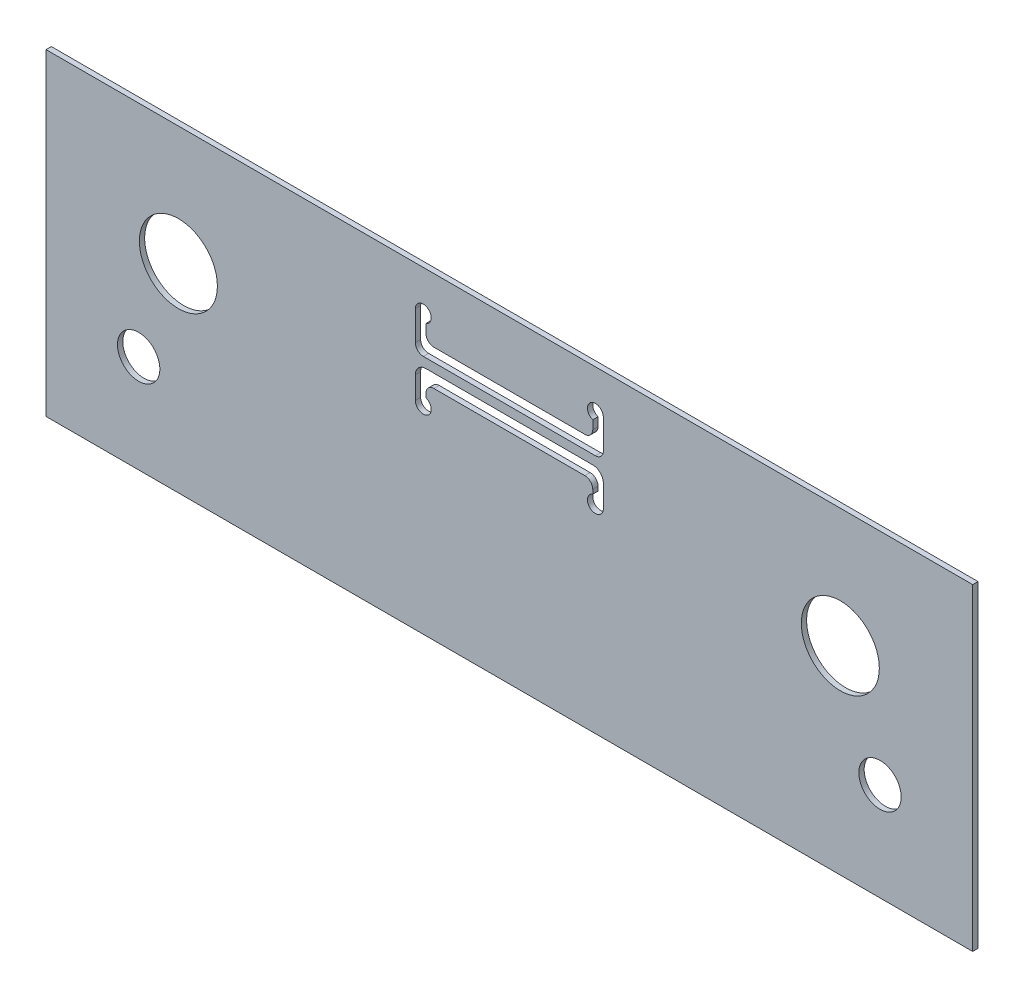
ISO-10303-21;
HEADER;
FILE_DESCRIPTION(('STEP AP214'),'2;1');
FILE_NAME('part.step','',(''),(''),'','','');
FILE_SCHEMA(('AUTOMOTIVE_DESIGN { 1 0 10303 214 1 1 1 1 }'));
ENDSEC;
DATA;
#1=APPLICATION_CONTEXT('core data for automotive mechanical design processes');
#2=APPLICATION_PROTOCOL_DEFINITION('international standard','automotive_design',2000,#1);
#3=PRODUCT_CONTEXT('',#1,'mechanical');
#4=PRODUCT('Part','Part','',(#3));
#5=PRODUCT_RELATED_PRODUCT_CATEGORY('part','',(#4));
#6=PRODUCT_DEFINITION_FORMATION('','',#4);
#7=PRODUCT_DEFINITION_CONTEXT('part definition',#1,'design');
#8=PRODUCT_DEFINITION('design','',#6,#7);
#9=PRODUCT_DEFINITION_SHAPE('','',#8);
#10=(LENGTH_UNIT() NAMED_UNIT(*) SI_UNIT(.MILLI.,.METRE.));
#11=(NAMED_UNIT(*) PLANE_ANGLE_UNIT() SI_UNIT($,.RADIAN.));
#12=(NAMED_UNIT(*) SI_UNIT($,.STERADIAN.) SOLID_ANGLE_UNIT());
#13=UNCERTAINTY_MEASURE_WITH_UNIT(LENGTH_MEASURE(1.E-05),#10,'distance_accuracy_value','');
#14=(GEOMETRIC_REPRESENTATION_CONTEXT(3) GLOBAL_UNCERTAINTY_ASSIGNED_CONTEXT((#13)) GLOBAL_UNIT_ASSIGNED_CONTEXT((#10,
#11,#12)) REPRESENTATION_CONTEXT('',''));
#15=CARTESIAN_POINT('',(0.,0.,0.));
#16=DIRECTION('',(0.,0.,1.));
#17=DIRECTION('',(1.,0.,0.));
#18=AXIS2_PLACEMENT_3D('',#15,#16,#17);
#19=CARTESIAN_POINT('',(0.,0.,0.2));
#20=DIRECTION('',(0.,0.,-1.));
#21=DIRECTION('',(-1.,0.,0.));
#22=AXIS2_PLACEMENT_3D('',#19,#20,#21);
#23=PLANE('',#22);
#24=CARTESIAN_POINT('',(30.,-4.5,0.2));
#25=DIRECTION('',(0.,0.,1.));
#26=DIRECTION('',(1.,0.,0.));
#27=AXIS2_PLACEMENT_3D('',#24,#25,#26);
#28=CIRCLE('',#27,1.4732);
#29=CARTESIAN_POINT('',(31.4732,-4.5,0.2));
#30=VERTEX_POINT('',#29);
#31=EDGE_CURVE('E263',#30,#30,#28,.T.);
#32=ORIENTED_EDGE('',*,*,#31,.F.);
#33=EDGE_LOOP('',(#32));
#34=FACE_BOUND('',#33,.T.);
#35=CARTESIAN_POINT('',(5.,-4.5,0.2));
#36=DIRECTION('',(0.,0.,1.));
#37=DIRECTION('',(1.,0.,0.));
#38=AXIS2_PLACEMENT_3D('',#35,#36,#37);
#39=CIRCLE('',#38,1.4732);
#40=CARTESIAN_POINT('',(6.4732,-4.5,0.2));
#41=VERTEX_POINT('',#40);
#42=EDGE_CURVE('E313',#41,#41,#39,.T.);
#43=ORIENTED_EDGE('',*,*,#42,.F.);
#44=EDGE_LOOP('',(#43));
#45=FACE_BOUND('',#44,.T.);
#46=CARTESIAN_POINT('',(3.5,-8.3,0.2));
#47=DIRECTION('',(0.,0.,1.));
#48=DIRECTION('',(1.,0.,0.));
#49=AXIS2_PLACEMENT_3D('',#46,#47,#48);
#50=CIRCLE('',#49,0.800099999999999);
#51=CARTESIAN_POINT('',(4.3001,-8.3,0.2));
#52=VERTEX_POINT('',#51);
#53=EDGE_CURVE('E406',#52,#52,#50,.T.);
#54=ORIENTED_EDGE('',*,*,#53,.F.);
#55=EDGE_LOOP('',(#54));
#56=FACE_BOUND('',#55,.T.);
#57=DIRECTION('',(0.,-1.,0.));
#58=VECTOR('',#57,1.);
#59=CARTESIAN_POINT('',(0.,-12.,0.2));
#60=LINE('',#59,#58);
#61=CARTESIAN_POINT('',(0.,0.,0.2));
#62=VERTEX_POINT('',#61);
#63=CARTESIAN_POINT('',(0.,-12.,0.2));
#64=VERTEX_POINT('',#63);
#65=EDGE_CURVE('E412',#62,#64,#60,.T.);
#66=ORIENTED_EDGE('',*,*,#65,.T.);
#67=DIRECTION('',(1.,0.,0.));
#68=VECTOR('',#67,1.);
#69=CARTESIAN_POINT('',(35.,-12.,0.2));
#70=LINE('',#69,#68);
#71=CARTESIAN_POINT('',(35.,-12.,0.2));
#72=VERTEX_POINT('',#71);
#73=EDGE_CURVE('E415',#64,#72,#70,.T.);
#74=ORIENTED_EDGE('',*,*,#73,.T.);
#75=DIRECTION('',(0.,1.,0.));
#76=VECTOR('',#75,1.);
#77=CARTESIAN_POINT('',(35.,0.,0.2));
#78=LINE('',#77,#76);
#79=CARTESIAN_POINT('',(35.,0.,0.2));
#80=VERTEX_POINT('',#79);
#81=EDGE_CURVE('E418',#72,#80,#78,.T.);
#82=ORIENTED_EDGE('',*,*,#81,.T.);
#83=DIRECTION('',(-1.,0.,0.));
#84=VECTOR('',#83,1.);
#85=CARTESIAN_POINT('',(0.,0.,0.2));
#86=LINE('',#85,#84);
#87=EDGE_CURVE('E420',#80,#62,#86,.T.);
#88=ORIENTED_EDGE('',*,*,#87,.T.);
#89=EDGE_LOOP('',(#66,#74,#82,#88));
#90=FACE_BOUND('',#89,.T.);
#91=CARTESIAN_POINT('',(14.35,-3.66,0.2));
#92=DIRECTION('',(0.,0.,1.));
#93=DIRECTION('',(-1.,0.,0.));
#94=AXIS2_PLACEMENT_3D('',#91,#92,#93);
#95=CIRCLE('',#94,0.400000000000001);
#96=CARTESIAN_POINT('',(14.35,-3.26,0.2));
#97=VERTEX_POINT('',#96);
#98=CARTESIAN_POINT('',(13.95,-3.66,0.2));
#99=VERTEX_POINT('',#98);
#100=EDGE_CURVE('E319',#97,#99,#95,.T.);
#101=ORIENTED_EDGE('',*,*,#100,.F.);
#102=DIRECTION('',(-1.,0.,0.));
#103=VECTOR('',#102,1.);
#104=CARTESIAN_POINT('',(14.35,-3.26,0.2));
#105=LINE('',#104,#103);
#106=CARTESIAN_POINT('',(20.65,-3.26,0.2));
#107=VERTEX_POINT('',#106);
#108=EDGE_CURVE('E343',#107,#97,#105,.T.);
#109=ORIENTED_EDGE('',*,*,#108,.F.);
#110=CARTESIAN_POINT('',(20.65,-3.66,0.2));
#111=DIRECTION('',(0.,0.,1.));
#112=DIRECTION('',(-1.,0.,0.));
#113=AXIS2_PLACEMENT_3D('',#110,#111,#112);
#114=CIRCLE('',#113,0.400000000000002);
#115=CARTESIAN_POINT('',(21.05,-3.66,0.2));
#116=VERTEX_POINT('',#115);
#117=EDGE_CURVE('E340',#116,#107,#114,.T.);
#118=ORIENTED_EDGE('',*,*,#117,.F.);
#119=DIRECTION('',(0.,1.,0.));
#120=VECTOR('',#119,1.);
#121=CARTESIAN_POINT('',(21.05,-3.66,0.2));
#122=LINE('',#121,#120);
#123=CARTESIAN_POINT('',(21.05,-4.5,0.2));
#124=VERTEX_POINT('',#123);
#125=EDGE_CURVE('E338',#124,#116,#122,.T.);
#126=ORIENTED_EDGE('',*,*,#125,.F.);
#127=CARTESIAN_POINT('',(20.75,-4.5,0.2));
#128=DIRECTION('',(0.,0.,1.));
#129=DIRECTION('',(1.,0.,0.));
#130=AXIS2_PLACEMENT_3D('',#127,#128,#129);
#131=CIRCLE('',#130,0.300000000000001);
#132=CARTESIAN_POINT('',(20.65,-4.21715728752538,0.2));
#133=VERTEX_POINT('',#132);
#134=EDGE_CURVE('E336',#133,#124,#131,.T.);
#135=ORIENTED_EDGE('',*,*,#134,.F.);
#136=DIRECTION('',(0.,-1.,0.));
#137=VECTOR('',#136,1.);
#138=CARTESIAN_POINT('',(20.65,-4.06,0.2));
#139=LINE('',#138,#137);
#140=CARTESIAN_POINT('',(20.65,-4.06,0.2));
#141=VERTEX_POINT('',#140);
#142=EDGE_CURVE('E334',#141,#133,#139,.T.);
#143=ORIENTED_EDGE('',*,*,#142,.F.);
#144=CARTESIAN_POINT('',(20.35,-4.06,0.2));
#145=DIRECTION('',(0.,0.,-1.));
#146=DIRECTION('',(-1.,0.,0.));
#147=AXIS2_PLACEMENT_3D('',#144,#145,#146);
#148=CIRCLE('',#147,0.299999999999999);
#149=CARTESIAN_POINT('',(20.35,-3.76,0.2));
#150=VERTEX_POINT('',#149);
#151=EDGE_CURVE('E332',#150,#141,#148,.T.);
#152=ORIENTED_EDGE('',*,*,#151,.F.);
#153=DIRECTION('',(1.,0.,0.));
#154=VECTOR('',#153,1.);
#155=CARTESIAN_POINT('',(14.65,-3.76,0.2));
#156=LINE('',#155,#154);
#157=CARTESIAN_POINT('',(14.65,-3.76,0.2));
#158=VERTEX_POINT('',#157);
#159=EDGE_CURVE('E330',#158,#150,#156,.T.);
#160=ORIENTED_EDGE('',*,*,#159,.F.);
#161=CARTESIAN_POINT('',(14.65,-4.06,0.2));
#162=DIRECTION('',(0.,0.,-1.));
#163=DIRECTION('',(-1.,0.,0.));
#164=AXIS2_PLACEMENT_3D('',#161,#162,#163);
#165=CIRCLE('',#164,0.299999999999999);
#166=CARTESIAN_POINT('',(14.35,-4.06,0.2));
#167=VERTEX_POINT('',#166);
#168=EDGE_CURVE('E328',#167,#158,#165,.T.);
#169=ORIENTED_EDGE('',*,*,#168,.F.);
#170=DIRECTION('',(0.,1.,0.));
#171=VECTOR('',#170,1.);
#172=CARTESIAN_POINT('',(14.35,-4.21715728752538,0.2));
#173=LINE('',#172,#171);
#174=CARTESIAN_POINT('',(14.35,-4.21715728752538,0.2));
#175=VERTEX_POINT('',#174);
#176=EDGE_CURVE('E326',#175,#167,#173,.T.);
#177=ORIENTED_EDGE('',*,*,#176,.F.);
#178=CARTESIAN_POINT('',(14.25,-4.5,0.2));
#179=DIRECTION('',(0.,0.,1.));
#180=DIRECTION('',(1.,0.,0.));
#181=AXIS2_PLACEMENT_3D('',#178,#179,#180);
#182=CIRCLE('',#181,0.3);
#183=CARTESIAN_POINT('',(13.95,-4.5,0.2));
#184=VERTEX_POINT('',#183);
#185=EDGE_CURVE('E324',#184,#175,#182,.T.);
#186=ORIENTED_EDGE('',*,*,#185,.F.);
#187=DIRECTION('',(0.,-1.,0.));
#188=VECTOR('',#187,1.);
#189=CARTESIAN_POINT('',(13.95,-4.5,0.2));
#190=LINE('',#189,#188);
#191=EDGE_CURVE('E321',#99,#184,#190,.T.);
#192=ORIENTED_EDGE('',*,*,#191,.F.);
#193=EDGE_LOOP('',(#101,#109,#118,#126,#135,#143,#152,#160,#169,#177,#186,#192));
#194=FACE_BOUND('',#193,.T.);
#195=CARTESIAN_POINT('',(14.65,-2.11,0.2));
#196=DIRECTION('',(0.,0.,-1.));
#197=DIRECTION('',(-1.,0.,0.));
#198=AXIS2_PLACEMENT_3D('',#195,#196,#197);
#199=CIRCLE('',#198,0.300000000000001);
#200=CARTESIAN_POINT('',(14.65,-2.41,0.2));
#201=VERTEX_POINT('',#200);
#202=CARTESIAN_POINT('',(14.35,-2.11,0.2));
#203=VERTEX_POINT('',#202);
#204=EDGE_CURVE('E217',#201,#203,#199,.T.);
#205=ORIENTED_EDGE('',*,*,#204,.F.);
#206=DIRECTION('',(-1.,0.,0.));
#207=VECTOR('',#206,1.);
#208=CARTESIAN_POINT('',(14.65,-2.41,0.2));
#209=LINE('',#208,#207);
#210=CARTESIAN_POINT('',(20.35,-2.41,0.2));
#211=VERTEX_POINT('',#210);
#212=EDGE_CURVE('E260',#211,#201,#209,.T.);
#213=ORIENTED_EDGE('',*,*,#212,.F.);
#214=CARTESIAN_POINT('',(20.35,-2.11,0.2));
#215=DIRECTION('',(0.,0.,-1.));
#216=DIRECTION('',(1.,0.,0.));
#217=AXIS2_PLACEMENT_3D('',#214,#215,#216);
#218=CIRCLE('',#217,0.300000000000001);
#219=CARTESIAN_POINT('',(20.65,-2.11,0.2));
#220=VERTEX_POINT('',#219);
#221=EDGE_CURVE('E258',#220,#211,#218,.T.);
#222=ORIENTED_EDGE('',*,*,#221,.F.);
#223=DIRECTION('',(0.,-1.,0.));
#224=VECTOR('',#223,1.);
#225=CARTESIAN_POINT('',(20.65,-2.11,0.2));
#226=LINE('',#225,#224);
#227=CARTESIAN_POINT('',(20.65,-1.78284271247462,0.2));
#228=VERTEX_POINT('',#227);
#229=EDGE_CURVE('E256',#228,#220,#226,.T.);
#230=ORIENTED_EDGE('',*,*,#229,.F.);
#231=CARTESIAN_POINT('',(20.75,-1.5,0.2));
#232=DIRECTION('',(0.,0.,1.));
#233=DIRECTION('',(1.,0.,0.));
#234=AXIS2_PLACEMENT_3D('',#231,#232,#233);
#235=CIRCLE('',#234,0.3);
#236=CARTESIAN_POINT('',(21.05,-1.5,0.2));
#237=VERTEX_POINT('',#236);
#238=EDGE_CURVE('E254',#237,#228,#235,.T.);
#239=ORIENTED_EDGE('',*,*,#238,.F.);
#240=DIRECTION('',(0.,1.,0.));
#241=VECTOR('',#240,1.);
#242=CARTESIAN_POINT('',(21.05,-2.61,0.2));
#243=LINE('',#242,#241);
#244=CARTESIAN_POINT('',(21.05,-2.61,0.2));
#245=VERTEX_POINT('',#244);
#246=EDGE_CURVE('E252',#245,#237,#243,.T.);
#247=ORIENTED_EDGE('',*,*,#246,.F.);
#248=CARTESIAN_POINT('',(20.75,-2.61,0.2));
#249=DIRECTION('',(0.,0.,1.));
#250=DIRECTION('',(1.,0.,0.));
#251=AXIS2_PLACEMENT_3D('',#248,#249,#250);
#252=CIRCLE('',#251,0.299999999999999);
#253=CARTESIAN_POINT('',(20.75,-2.91,0.2));
#254=VERTEX_POINT('',#253);
#255=EDGE_CURVE('E250',#254,#245,#252,.T.);
#256=ORIENTED_EDGE('',*,*,#255,.F.);
#257=DIRECTION('',(1.,0.,0.));
#258=VECTOR('',#257,1.);
#259=CARTESIAN_POINT('',(14.25,-2.91,0.2));
#260=LINE('',#259,#258);
#261=CARTESIAN_POINT('',(14.25,-2.91,0.2));
#262=VERTEX_POINT('',#261);
#263=EDGE_CURVE('E248',#262,#254,#260,.T.);
#264=ORIENTED_EDGE('',*,*,#263,.F.);
#265=CARTESIAN_POINT('',(14.25,-2.61,0.2));
#266=DIRECTION('',(0.,0.,1.));
#267=DIRECTION('',(1.,0.,0.));
#268=AXIS2_PLACEMENT_3D('',#265,#266,#267);
#269=CIRCLE('',#268,0.3);
#270=CARTESIAN_POINT('',(13.95,-2.61,0.2));
#271=VERTEX_POINT('',#270);
#272=EDGE_CURVE('E246',#271,#262,#269,.T.);
#273=ORIENTED_EDGE('',*,*,#272,.F.);
#274=DIRECTION('',(0.,-1.,0.));
#275=VECTOR('',#274,1.);
#276=CARTESIAN_POINT('',(13.95,-1.5,0.2));
#277=LINE('',#276,#275);
#278=CARTESIAN_POINT('',(13.95,-1.5,0.2));
#279=VERTEX_POINT('',#278);
#280=EDGE_CURVE('E241',#279,#271,#277,.T.);
#281=ORIENTED_EDGE('',*,*,#280,.F.);
#282=CARTESIAN_POINT('',(14.25,-1.5,0.2));
#283=DIRECTION('',(0.,0.,1.));
#284=DIRECTION('',(1.,0.,0.));
#285=AXIS2_PLACEMENT_3D('',#282,#283,#284);
#286=CIRCLE('',#285,0.3);
#287=CARTESIAN_POINT('',(14.35,-1.78284271247462,0.2));
#288=VERTEX_POINT('',#287);
#289=EDGE_CURVE('E239',#288,#279,#286,.T.);
#290=ORIENTED_EDGE('',*,*,#289,.F.);
#291=DIRECTION('',(0.,1.,0.));
#292=VECTOR('',#291,1.);
#293=CARTESIAN_POINT('',(14.35,-2.11,0.2));
#294=LINE('',#293,#292);
#295=EDGE_CURVE('E225',#203,#288,#294,.T.);
#296=ORIENTED_EDGE('',*,*,#295,.F.);
#297=EDGE_LOOP('',(#205,#213,#222,#230,#239,#247,#256,#264,#273,#281,#290,#296));
#298=FACE_BOUND('',#297,.T.);
#299=CARTESIAN_POINT('',(31.5,-8.3,0.2));
#300=DIRECTION('',(0.,0.,1.));
#301=DIRECTION('',(1.,0.,0.));
#302=AXIS2_PLACEMENT_3D('',#299,#300,#301);
#303=CIRCLE('',#302,0.800100000000007);
#304=CARTESIAN_POINT('',(32.3001,-8.3,0.2));
#305=VERTEX_POINT('',#304);
#306=EDGE_CURVE('E598',#305,#305,#303,.T.);
#307=ORIENTED_EDGE('',*,*,#306,.F.);
#308=EDGE_LOOP('',(#307));
#309=FACE_BOUND('',#308,.T.);
#310=ADVANCED_FACE('F32',(#34,#45,#56,#90,#194,#298,#309),#23,.F.);
#311=CARTESIAN_POINT('',(0.,0.,0.));
#312=DIRECTION('',(0.,0.,-1.));
#313=DIRECTION('',(-1.,0.,0.));
#314=AXIS2_PLACEMENT_3D('',#311,#312,#313);
#315=PLANE('',#314);
#316=CARTESIAN_POINT('',(30.,-4.5,0.));
#317=DIRECTION('',(0.,0.,1.));
#318=DIRECTION('',(1.,0.,0.));
#319=AXIS2_PLACEMENT_3D('',#316,#317,#318);
#320=CIRCLE('',#319,1.4732);
#321=CARTESIAN_POINT('',(31.4732,-4.5,0.));
#322=VERTEX_POINT('',#321);
#323=EDGE_CURVE('E604',#322,#322,#320,.T.);
#324=ORIENTED_EDGE('',*,*,#323,.T.);
#325=EDGE_LOOP('',(#324));
#326=FACE_BOUND('',#325,.T.);
#327=CARTESIAN_POINT('',(5.,-4.5,0.));
#328=DIRECTION('',(0.,0.,1.));
#329=DIRECTION('',(1.,0.,0.));
#330=AXIS2_PLACEMENT_3D('',#327,#328,#329);
#331=CIRCLE('',#330,1.4732);
#332=CARTESIAN_POINT('',(6.4732,-4.5,0.));
#333=VERTEX_POINT('',#332);
#334=EDGE_CURVE('E233',#333,#333,#331,.T.);
#335=ORIENTED_EDGE('',*,*,#334,.T.);
#336=EDGE_LOOP('',(#335));
#337=FACE_BOUND('',#336,.T.);
#338=CARTESIAN_POINT('',(3.5,-8.3,0.));
#339=DIRECTION('',(0.,0.,1.));
#340=DIRECTION('',(1.,0.,0.));
#341=AXIS2_PLACEMENT_3D('',#338,#339,#340);
#342=CIRCLE('',#341,0.800099999999999);
#343=CARTESIAN_POINT('',(4.3001,-8.3,0.));
#344=VERTEX_POINT('',#343);
#345=EDGE_CURVE('E405',#344,#344,#342,.T.);
#346=ORIENTED_EDGE('',*,*,#345,.T.);
#347=EDGE_LOOP('',(#346));
#348=FACE_BOUND('',#347,.T.);
#349=DIRECTION('',(0.,-1.,0.));
#350=VECTOR('',#349,1.);
#351=CARTESIAN_POINT('',(0.,-12.,0.));
#352=LINE('',#351,#350);
#353=CARTESIAN_POINT('',(0.,0.,0.));
#354=VERTEX_POINT('',#353);
#355=CARTESIAN_POINT('',(0.,-12.,0.));
#356=VERTEX_POINT('',#355);
#357=EDGE_CURVE('E409',#354,#356,#352,.T.);
#358=ORIENTED_EDGE('',*,*,#357,.F.);
#359=DIRECTION('',(-1.,0.,0.));
#360=VECTOR('',#359,1.);
#361=CARTESIAN_POINT('',(0.,0.,0.));
#362=LINE('',#361,#360);
#363=CARTESIAN_POINT('',(35.,0.,0.));
#364=VERTEX_POINT('',#363);
#365=EDGE_CURVE('E416',#364,#354,#362,.T.);
#366=ORIENTED_EDGE('',*,*,#365,.F.);
#367=DIRECTION('',(0.,1.,0.));
#368=VECTOR('',#367,1.);
#369=CARTESIAN_POINT('',(35.,0.,0.));
#370=LINE('',#369,#368);
#371=CARTESIAN_POINT('',(35.,-12.,0.));
#372=VERTEX_POINT('',#371);
#373=EDGE_CURVE('E427',#372,#364,#370,.T.);
#374=ORIENTED_EDGE('',*,*,#373,.F.);
#375=DIRECTION('',(1.,0.,0.));
#376=VECTOR('',#375,1.);
#377=CARTESIAN_POINT('',(35.,-12.,0.));
#378=LINE('',#377,#376);
#379=EDGE_CURVE('E425',#356,#372,#378,.T.);
#380=ORIENTED_EDGE('',*,*,#379,.F.);
#381=EDGE_LOOP('',(#358,#366,#374,#380));
#382=FACE_BOUND('',#381,.T.);
#383=DIRECTION('',(-1.,0.,0.));
#384=VECTOR('',#383,1.);
#385=CARTESIAN_POINT('',(14.35,-3.26,0.));
#386=LINE('',#385,#384);
#387=CARTESIAN_POINT('',(20.65,-3.26,0.));
#388=VERTEX_POINT('',#387);
#389=CARTESIAN_POINT('',(14.35,-3.26,0.));
#390=VERTEX_POINT('',#389);
#391=EDGE_CURVE('E322',#388,#390,#386,.T.);
#392=ORIENTED_EDGE('',*,*,#391,.T.);
#393=CARTESIAN_POINT('',(14.35,-3.66,0.));
#394=DIRECTION('',(0.,0.,1.));
#395=DIRECTION('',(-1.,0.,0.));
#396=AXIS2_PLACEMENT_3D('',#393,#394,#395);
#397=CIRCLE('',#396,0.400000000000001);
#398=CARTESIAN_POINT('',(13.95,-3.66,0.));
#399=VERTEX_POINT('',#398);
#400=EDGE_CURVE('E316',#390,#399,#397,.T.);
#401=ORIENTED_EDGE('',*,*,#400,.T.);
#402=DIRECTION('',(0.,-1.,0.));
#403=VECTOR('',#402,1.);
#404=CARTESIAN_POINT('',(13.95,-4.5,0.));
#405=LINE('',#404,#403);
#406=CARTESIAN_POINT('',(13.95,-4.5,0.));
#407=VERTEX_POINT('',#406);
#408=EDGE_CURVE('E348',#399,#407,#405,.T.);
#409=ORIENTED_EDGE('',*,*,#408,.T.);
#410=CARTESIAN_POINT('',(14.25,-4.5,0.));
#411=DIRECTION('',(0.,0.,1.));
#412=DIRECTION('',(1.,0.,0.));
#413=AXIS2_PLACEMENT_3D('',#410,#411,#412);
#414=CIRCLE('',#413,0.3);
#415=CARTESIAN_POINT('',(14.35,-4.21715728752538,0.));
#416=VERTEX_POINT('',#415);
#417=EDGE_CURVE('E351',#407,#416,#414,.T.);
#418=ORIENTED_EDGE('',*,*,#417,.T.);
#419=DIRECTION('',(0.,1.,0.));
#420=VECTOR('',#419,1.);
#421=CARTESIAN_POINT('',(14.35,-4.21715728752538,0.));
#422=LINE('',#421,#420);
#423=CARTESIAN_POINT('',(14.35,-4.06,0.));
#424=VERTEX_POINT('',#423);
#425=EDGE_CURVE('E354',#416,#424,#422,.T.);
#426=ORIENTED_EDGE('',*,*,#425,.T.);
#427=CARTESIAN_POINT('',(14.65,-4.06,0.));
#428=DIRECTION('',(0.,0.,-1.));
#429=DIRECTION('',(-1.,0.,0.));
#430=AXIS2_PLACEMENT_3D('',#427,#428,#429);
#431=CIRCLE('',#430,0.299999999999999);
#432=CARTESIAN_POINT('',(14.65,-3.76,0.));
#433=VERTEX_POINT('',#432);
#434=EDGE_CURVE('E357',#424,#433,#431,.T.);
#435=ORIENTED_EDGE('',*,*,#434,.T.);
#436=DIRECTION('',(1.,0.,0.));
#437=VECTOR('',#436,1.);
#438=CARTESIAN_POINT('',(14.65,-3.76,0.));
#439=LINE('',#438,#437);
#440=CARTESIAN_POINT('',(20.35,-3.76,0.));
#441=VERTEX_POINT('',#440);
#442=EDGE_CURVE('E360',#433,#441,#439,.T.);
#443=ORIENTED_EDGE('',*,*,#442,.T.);
#444=CARTESIAN_POINT('',(20.35,-4.06,0.));
#445=DIRECTION('',(0.,0.,-1.));
#446=DIRECTION('',(-1.,0.,0.));
#447=AXIS2_PLACEMENT_3D('',#444,#445,#446);
#448=CIRCLE('',#447,0.299999999999999);
#449=CARTESIAN_POINT('',(20.65,-4.06,0.));
#450=VERTEX_POINT('',#449);
#451=EDGE_CURVE('E363',#441,#450,#448,.T.);
#452=ORIENTED_EDGE('',*,*,#451,.T.);
#453=DIRECTION('',(0.,-1.,0.));
#454=VECTOR('',#453,1.);
#455=CARTESIAN_POINT('',(20.65,-4.06,0.));
#456=LINE('',#455,#454);
#457=CARTESIAN_POINT('',(20.65,-4.21715728752538,0.));
#458=VERTEX_POINT('',#457);
#459=EDGE_CURVE('E366',#450,#458,#456,.T.);
#460=ORIENTED_EDGE('',*,*,#459,.T.);
#461=CARTESIAN_POINT('',(20.75,-4.5,0.));
#462=DIRECTION('',(0.,0.,1.));
#463=DIRECTION('',(1.,0.,0.));
#464=AXIS2_PLACEMENT_3D('',#461,#462,#463);
#465=CIRCLE('',#464,0.300000000000001);
#466=CARTESIAN_POINT('',(21.05,-4.5,0.));
#467=VERTEX_POINT('',#466);
#468=EDGE_CURVE('E369',#458,#467,#465,.T.);
#469=ORIENTED_EDGE('',*,*,#468,.T.);
#470=DIRECTION('',(0.,1.,0.));
#471=VECTOR('',#470,1.);
#472=CARTESIAN_POINT('',(21.05,-3.66,0.));
#473=LINE('',#472,#471);
#474=CARTESIAN_POINT('',(21.05,-3.66,0.));
#475=VERTEX_POINT('',#474);
#476=EDGE_CURVE('E372',#467,#475,#473,.T.);
#477=ORIENTED_EDGE('',*,*,#476,.T.);
#478=CARTESIAN_POINT('',(20.65,-3.66,0.));
#479=DIRECTION('',(0.,0.,1.));
#480=DIRECTION('',(-1.,0.,0.));
#481=AXIS2_PLACEMENT_3D('',#478,#479,#480);
#482=CIRCLE('',#481,0.400000000000002);
#483=EDGE_CURVE('E375',#475,#388,#482,.T.);
#484=ORIENTED_EDGE('',*,*,#483,.T.);
#485=EDGE_LOOP('',(#392,#401,#409,#418,#426,#435,#443,#452,#460,#469,#477,#484));
#486=FACE_BOUND('',#485,.T.);
#487=DIRECTION('',(-1.,0.,0.));
#488=VECTOR('',#487,1.);
#489=CARTESIAN_POINT('',(14.65,-2.41,0.));
#490=LINE('',#489,#488);
#491=CARTESIAN_POINT('',(20.35,-2.41,0.));
#492=VERTEX_POINT('',#491);
#493=CARTESIAN_POINT('',(14.65,-2.41,0.));
#494=VERTEX_POINT('',#493);
#495=EDGE_CURVE('E226',#492,#494,#490,.T.);
#496=ORIENTED_EDGE('',*,*,#495,.T.);
#497=CARTESIAN_POINT('',(14.65,-2.11,0.));
#498=DIRECTION('',(0.,0.,-1.));
#499=DIRECTION('',(-1.,0.,0.));
#500=AXIS2_PLACEMENT_3D('',#497,#498,#499);
#501=CIRCLE('',#500,0.300000000000001);
#502=CARTESIAN_POINT('',(14.35,-2.11,0.));
#503=VERTEX_POINT('',#502);
#504=EDGE_CURVE('E55',#494,#503,#501,.T.);
#505=ORIENTED_EDGE('',*,*,#504,.T.);
#506=DIRECTION('',(0.,1.,0.));
#507=VECTOR('',#506,1.);
#508=CARTESIAN_POINT('',(14.35,-2.11,0.));
#509=LINE('',#508,#507);
#510=CARTESIAN_POINT('',(14.35,-1.78284271247462,0.));
#511=VERTEX_POINT('',#510);
#512=EDGE_CURVE('E232',#503,#511,#509,.T.);
#513=ORIENTED_EDGE('',*,*,#512,.T.);
#514=CARTESIAN_POINT('',(14.25,-1.5,0.));
#515=DIRECTION('',(0.,0.,1.));
#516=DIRECTION('',(1.,0.,0.));
#517=AXIS2_PLACEMENT_3D('',#514,#515,#516);
#518=CIRCLE('',#517,0.3);
#519=CARTESIAN_POINT('',(13.95,-1.5,0.));
#520=VERTEX_POINT('',#519);
#521=EDGE_CURVE('E265',#511,#520,#518,.T.);
#522=ORIENTED_EDGE('',*,*,#521,.T.);
#523=DIRECTION('',(0.,-1.,0.));
#524=VECTOR('',#523,1.);
#525=CARTESIAN_POINT('',(13.95,-1.5,0.));
#526=LINE('',#525,#524);
#527=CARTESIAN_POINT('',(13.95,-2.61,0.));
#528=VERTEX_POINT('',#527);
#529=EDGE_CURVE('E268',#520,#528,#526,.T.);
#530=ORIENTED_EDGE('',*,*,#529,.T.);
#531=CARTESIAN_POINT('',(14.25,-2.61,0.));
#532=DIRECTION('',(0.,0.,1.));
#533=DIRECTION('',(1.,0.,0.));
#534=AXIS2_PLACEMENT_3D('',#531,#532,#533);
#535=CIRCLE('',#534,0.3);
#536=CARTESIAN_POINT('',(14.25,-2.91,0.));
#537=VERTEX_POINT('',#536);
#538=EDGE_CURVE('E271',#528,#537,#535,.T.);
#539=ORIENTED_EDGE('',*,*,#538,.T.);
#540=DIRECTION('',(1.,0.,0.));
#541=VECTOR('',#540,1.);
#542=CARTESIAN_POINT('',(14.25,-2.91,0.));
#543=LINE('',#542,#541);
#544=CARTESIAN_POINT('',(20.75,-2.91,0.));
#545=VERTEX_POINT('',#544);
#546=EDGE_CURVE('E274',#537,#545,#543,.T.);
#547=ORIENTED_EDGE('',*,*,#546,.T.);
#548=CARTESIAN_POINT('',(20.75,-2.61,0.));
#549=DIRECTION('',(0.,0.,1.));
#550=DIRECTION('',(1.,0.,0.));
#551=AXIS2_PLACEMENT_3D('',#548,#549,#550);
#552=CIRCLE('',#551,0.299999999999999);
#553=CARTESIAN_POINT('',(21.05,-2.61,0.));
#554=VERTEX_POINT('',#553);
#555=EDGE_CURVE('E277',#545,#554,#552,.T.);
#556=ORIENTED_EDGE('',*,*,#555,.T.);
#557=DIRECTION('',(0.,1.,0.));
#558=VECTOR('',#557,1.);
#559=CARTESIAN_POINT('',(21.05,-2.61,0.));
#560=LINE('',#559,#558);
#561=CARTESIAN_POINT('',(21.05,-1.5,0.));
#562=VERTEX_POINT('',#561);
#563=EDGE_CURVE('E280',#554,#562,#560,.T.);
#564=ORIENTED_EDGE('',*,*,#563,.T.);
#565=CARTESIAN_POINT('',(20.75,-1.5,0.));
#566=DIRECTION('',(0.,0.,1.));
#567=DIRECTION('',(1.,0.,0.));
#568=AXIS2_PLACEMENT_3D('',#565,#566,#567);
#569=CIRCLE('',#568,0.3);
#570=CARTESIAN_POINT('',(20.65,-1.78284271247462,0.));
#571=VERTEX_POINT('',#570);
#572=EDGE_CURVE('E283',#562,#571,#569,.T.);
#573=ORIENTED_EDGE('',*,*,#572,.T.);
#574=DIRECTION('',(0.,-1.,0.));
#575=VECTOR('',#574,1.);
#576=CARTESIAN_POINT('',(20.65,-2.11,0.));
#577=LINE('',#576,#575);
#578=CARTESIAN_POINT('',(20.65,-2.11,0.));
#579=VERTEX_POINT('',#578);
#580=EDGE_CURVE('E286',#571,#579,#577,.T.);
#581=ORIENTED_EDGE('',*,*,#580,.T.);
#582=CARTESIAN_POINT('',(20.35,-2.11,0.));
#583=DIRECTION('',(0.,0.,-1.));
#584=DIRECTION('',(1.,0.,0.));
#585=AXIS2_PLACEMENT_3D('',#582,#583,#584);
#586=CIRCLE('',#585,0.300000000000001);
#587=EDGE_CURVE('E289',#579,#492,#586,.T.);
#588=ORIENTED_EDGE('',*,*,#587,.T.);
#589=EDGE_LOOP('',(#496,#505,#513,#522,#530,#539,#547,#556,#564,#573,#581,#588));
#590=FACE_BOUND('',#589,.T.);
#591=CARTESIAN_POINT('',(31.5,-8.3,0.));
#592=DIRECTION('',(0.,0.,1.));
#593=DIRECTION('',(1.,0.,0.));
#594=AXIS2_PLACEMENT_3D('',#591,#592,#593);
#595=CIRCLE('',#594,0.800100000000007);
#596=CARTESIAN_POINT('',(32.3001,-8.3,0.));
#597=VERTEX_POINT('',#596);
#598=EDGE_CURVE('E601',#597,#597,#595,.T.);
#599=ORIENTED_EDGE('',*,*,#598,.T.);
#600=EDGE_LOOP('',(#599));
#601=FACE_BOUND('',#600,.T.);
#602=ADVANCED_FACE('F445',(#326,#337,#348,#382,#486,#590,#601),#315,.T.);
#603=CARTESIAN_POINT('',(0.,-12.,0.2));
#604=DIRECTION('',(1.,0.,0.));
#605=DIRECTION('',(0.,0.,-1.));
#606=AXIS2_PLACEMENT_3D('',#603,#604,#605);
#607=PLANE('',#606);
#608=ORIENTED_EDGE('',*,*,#357,.T.);
#609=DIRECTION('',(0.,0.,-1.));
#610=VECTOR('',#609,1.);
#611=CARTESIAN_POINT('',(0.,-12.,0.2));
#612=LINE('',#611,#610);
#613=EDGE_CURVE('E11',#64,#356,#612,.T.);
#614=ORIENTED_EDGE('',*,*,#613,.F.);
#615=ORIENTED_EDGE('',*,*,#65,.F.);
#616=DIRECTION('',(0.,0.,-1.));
#617=VECTOR('',#616,1.);
#618=CARTESIAN_POINT('',(0.,0.,0.2));
#619=LINE('',#618,#617);
#620=EDGE_CURVE('E422',#62,#354,#619,.T.);
#621=ORIENTED_EDGE('',*,*,#620,.T.);
#622=EDGE_LOOP('',(#608,#614,#615,#621));
#623=FACE_BOUND('',#622,.T.);
#624=ADVANCED_FACE('F34',(#623),#607,.F.);
#625=CARTESIAN_POINT('',(35.,-12.,0.2));
#626=DIRECTION('',(0.,1.,0.));
#627=DIRECTION('',(-1.,0.,0.));
#628=AXIS2_PLACEMENT_3D('',#625,#626,#627);
#629=PLANE('',#628);
#630=ORIENTED_EDGE('',*,*,#379,.T.);
#631=DIRECTION('',(0.,0.,-1.));
#632=VECTOR('',#631,1.);
#633=CARTESIAN_POINT('',(35.,-12.,0.2));
#634=LINE('',#633,#632);
#635=EDGE_CURVE('E40',#72,#372,#634,.T.);
#636=ORIENTED_EDGE('',*,*,#635,.F.);
#637=ORIENTED_EDGE('',*,*,#73,.F.);
#638=ORIENTED_EDGE('',*,*,#613,.T.);
#639=EDGE_LOOP('',(#630,#636,#637,#638));
#640=FACE_BOUND('',#639,.T.);
#641=ADVANCED_FACE('F456',(#640),#629,.F.);
#642=CARTESIAN_POINT('',(35.,0.,0.2));
#643=DIRECTION('',(-1.,0.,0.));
#644=DIRECTION('',(0.,-1.,0.));
#645=AXIS2_PLACEMENT_3D('',#642,#643,#644);
#646=PLANE('',#645);
#647=ORIENTED_EDGE('',*,*,#373,.T.);
#648=DIRECTION('',(0.,0.,-1.));
#649=VECTOR('',#648,1.);
#650=CARTESIAN_POINT('',(35.,0.,0.2));
#651=LINE('',#650,#649);
#652=EDGE_CURVE('E432',#80,#364,#651,.T.);
#653=ORIENTED_EDGE('',*,*,#652,.F.);
#654=ORIENTED_EDGE('',*,*,#81,.F.);
#655=ORIENTED_EDGE('',*,*,#635,.T.);
#656=EDGE_LOOP('',(#647,#653,#654,#655));
#657=FACE_BOUND('',#656,.T.);
#658=ADVANCED_FACE('F439',(#657),#646,.F.);
#659=CARTESIAN_POINT('',(0.,0.,0.2));
#660=DIRECTION('',(0.,-1.,0.));
#661=DIRECTION('',(0.,0.,-1.));
#662=AXIS2_PLACEMENT_3D('',#659,#660,#661);
#663=PLANE('',#662);
#664=ORIENTED_EDGE('',*,*,#365,.T.);
#665=ORIENTED_EDGE('',*,*,#620,.F.);
#666=ORIENTED_EDGE('',*,*,#87,.F.);
#667=ORIENTED_EDGE('',*,*,#652,.T.);
#668=EDGE_LOOP('',(#664,#665,#666,#667));
#669=FACE_BOUND('',#668,.T.);
#670=ADVANCED_FACE('F449',(#669),#663,.F.);
#671=CARTESIAN_POINT('',(3.5,-8.3,0.2));
#672=DIRECTION('',(0.,0.,-1.));
#673=DIRECTION('',(-1.,0.,0.));
#674=AXIS2_PLACEMENT_3D('',#671,#672,#673);
#675=CYLINDRICAL_SURFACE('',#674,0.800099999999999);
#676=ORIENTED_EDGE('',*,*,#53,.T.);
#677=EDGE_LOOP('',(#676));
#678=FACE_BOUND('',#677,.T.);
#679=ORIENTED_EDGE('',*,*,#345,.F.);
#680=EDGE_LOOP('',(#679));
#681=FACE_BOUND('',#680,.T.);
#682=ADVANCED_FACE('F474',(#678,#681),#675,.F.);
#683=CARTESIAN_POINT('',(14.35,-3.66,0.2));
#684=DIRECTION('',(0.,0.,-1.));
#685=DIRECTION('',(-1.,0.,0.));
#686=AXIS2_PLACEMENT_3D('',#683,#684,#685);
#687=CYLINDRICAL_SURFACE('',#686,0.400000000000001);
#688=ORIENTED_EDGE('',*,*,#400,.F.);
#689=DIRECTION('',(0.,0.,-1.));
#690=VECTOR('',#689,1.);
#691=CARTESIAN_POINT('',(14.35,-3.26,0.2));
#692=LINE('',#691,#690);
#693=EDGE_CURVE('E345',#97,#390,#692,.T.);
#694=ORIENTED_EDGE('',*,*,#693,.F.);
#695=ORIENTED_EDGE('',*,*,#100,.T.);
#696=DIRECTION('',(0.,0.,-1.));
#697=VECTOR('',#696,1.);
#698=CARTESIAN_POINT('',(13.95,-3.66,0.2));
#699=LINE('',#698,#697);
#700=EDGE_CURVE('E402',#99,#399,#699,.T.);
#701=ORIENTED_EDGE('',*,*,#700,.T.);
#702=EDGE_LOOP('',(#688,#694,#695,#701));
#703=FACE_BOUND('',#702,.T.);
#704=ADVANCED_FACE('F481',(#703),#687,.F.);
#705=CARTESIAN_POINT('',(13.95,-4.5,0.2));
#706=DIRECTION('',(1.,0.,0.));
#707=DIRECTION('',(0.,1.,0.));
#708=AXIS2_PLACEMENT_3D('',#705,#706,#707);
#709=PLANE('',#708);
#710=ORIENTED_EDGE('',*,*,#408,.F.);
#711=ORIENTED_EDGE('',*,*,#700,.F.);
#712=ORIENTED_EDGE('',*,*,#191,.T.);
#713=DIRECTION('',(0.,0.,-1.));
#714=VECTOR('',#713,1.);
#715=CARTESIAN_POINT('',(13.95,-4.5,0.2));
#716=LINE('',#715,#714);
#717=EDGE_CURVE('E400',#184,#407,#716,.T.);
#718=ORIENTED_EDGE('',*,*,#717,.T.);
#719=EDGE_LOOP('',(#710,#711,#712,#718));
#720=FACE_BOUND('',#719,.T.);
#721=ADVANCED_FACE('F486',(#720),#709,.T.);
#722=CARTESIAN_POINT('',(14.25,-4.5,0.2));
#723=DIRECTION('',(0.,0.,-1.));
#724=DIRECTION('',(-1.,0.,0.));
#725=AXIS2_PLACEMENT_3D('',#722,#723,#724);
#726=CYLINDRICAL_SURFACE('',#725,0.3);
#727=ORIENTED_EDGE('',*,*,#417,.F.);
#728=ORIENTED_EDGE('',*,*,#717,.F.);
#729=ORIENTED_EDGE('',*,*,#185,.T.);
#730=DIRECTION('',(0.,0.,-1.));
#731=VECTOR('',#730,1.);
#732=CARTESIAN_POINT('',(14.35,-4.21715728752538,0.2));
#733=LINE('',#732,#731);
#734=EDGE_CURVE('E398',#175,#416,#733,.T.);
#735=ORIENTED_EDGE('',*,*,#734,.T.);
#736=EDGE_LOOP('',(#727,#728,#729,#735));
#737=FACE_BOUND('',#736,.T.);
#738=ADVANCED_FACE('F496',(#737),#726,.F.);
#739=CARTESIAN_POINT('',(14.35,-4.21715728752538,0.2));
#740=DIRECTION('',(-1.,0.,0.));
#741=DIRECTION('',(0.,-1.,0.));
#742=AXIS2_PLACEMENT_3D('',#739,#740,#741);
#743=PLANE('',#742);
#744=ORIENTED_EDGE('',*,*,#425,.F.);
#745=ORIENTED_EDGE('',*,*,#734,.F.);
#746=ORIENTED_EDGE('',*,*,#176,.T.);
#747=DIRECTION('',(0.,0.,-1.));
#748=VECTOR('',#747,1.);
#749=CARTESIAN_POINT('',(14.35,-4.06,0.2));
#750=LINE('',#749,#748);
#751=EDGE_CURVE('E396',#167,#424,#750,.T.);
#752=ORIENTED_EDGE('',*,*,#751,.T.);
#753=EDGE_LOOP('',(#744,#745,#746,#752));
#754=FACE_BOUND('',#753,.T.);
#755=ADVANCED_FACE('F502',(#754),#743,.T.);
#756=CARTESIAN_POINT('',(14.65,-4.06,0.2));
#757=DIRECTION('',(0.,0.,-1.));
#758=DIRECTION('',(-1.,0.,0.));
#759=AXIS2_PLACEMENT_3D('',#756,#757,#758);
#760=CYLINDRICAL_SURFACE('',#759,0.299999999999999);
#761=ORIENTED_EDGE('',*,*,#434,.F.);
#762=ORIENTED_EDGE('',*,*,#751,.F.);
#763=ORIENTED_EDGE('',*,*,#168,.T.);
#764=DIRECTION('',(0.,0.,-1.));
#765=VECTOR('',#764,1.);
#766=CARTESIAN_POINT('',(14.65,-3.76,0.2));
#767=LINE('',#766,#765);
#768=EDGE_CURVE('E394',#158,#433,#767,.T.);
#769=ORIENTED_EDGE('',*,*,#768,.T.);
#770=EDGE_LOOP('',(#761,#762,#763,#769));
#771=FACE_BOUND('',#770,.T.);
#772=ADVANCED_FACE('F506',(#771),#760,.T.);
#773=CARTESIAN_POINT('',(14.65,-3.76,0.2));
#774=DIRECTION('',(0.,1.,0.));
#775=DIRECTION('',(0.,0.,1.));
#776=AXIS2_PLACEMENT_3D('',#773,#774,#775);
#777=PLANE('',#776);
#778=ORIENTED_EDGE('',*,*,#442,.F.);
#779=ORIENTED_EDGE('',*,*,#768,.F.);
#780=ORIENTED_EDGE('',*,*,#159,.T.);
#781=DIRECTION('',(0.,0.,-1.));
#782=VECTOR('',#781,1.);
#783=CARTESIAN_POINT('',(20.35,-3.76,0.2));
#784=LINE('',#783,#782);
#785=EDGE_CURVE('E392',#150,#441,#784,.T.);
#786=ORIENTED_EDGE('',*,*,#785,.T.);
#787=EDGE_LOOP('',(#778,#779,#780,#786));
#788=FACE_BOUND('',#787,.T.);
#789=ADVANCED_FACE('F510',(#788),#777,.T.);
#790=CARTESIAN_POINT('',(20.35,-4.06,0.2));
#791=DIRECTION('',(0.,0.,-1.));
#792=DIRECTION('',(-1.,0.,0.));
#793=AXIS2_PLACEMENT_3D('',#790,#791,#792);
#794=CYLINDRICAL_SURFACE('',#793,0.299999999999999);
#795=ORIENTED_EDGE('',*,*,#451,.F.);
#796=ORIENTED_EDGE('',*,*,#785,.F.);
#797=ORIENTED_EDGE('',*,*,#151,.T.);
#798=DIRECTION('',(0.,0.,-1.));
#799=VECTOR('',#798,1.);
#800=CARTESIAN_POINT('',(20.65,-4.06,0.2));
#801=LINE('',#800,#799);
#802=EDGE_CURVE('E390',#141,#450,#801,.T.);
#803=ORIENTED_EDGE('',*,*,#802,.T.);
#804=EDGE_LOOP('',(#795,#796,#797,#803));
#805=FACE_BOUND('',#804,.T.);
#806=ADVANCED_FACE('F514',(#805),#794,.T.);
#807=CARTESIAN_POINT('',(20.65,-4.06,0.2));
#808=DIRECTION('',(1.,0.,0.));
#809=DIRECTION('',(0.,0.,-1.));
#810=AXIS2_PLACEMENT_3D('',#807,#808,#809);
#811=PLANE('',#810);
#812=ORIENTED_EDGE('',*,*,#459,.F.);
#813=ORIENTED_EDGE('',*,*,#802,.F.);
#814=ORIENTED_EDGE('',*,*,#142,.T.);
#815=DIRECTION('',(0.,0.,-1.));
#816=VECTOR('',#815,1.);
#817=CARTESIAN_POINT('',(20.65,-4.21715728752538,0.2));
#818=LINE('',#817,#816);
#819=EDGE_CURVE('E388',#133,#458,#818,.T.);
#820=ORIENTED_EDGE('',*,*,#819,.T.);
#821=EDGE_LOOP('',(#812,#813,#814,#820));
#822=FACE_BOUND('',#821,.T.);
#823=ADVANCED_FACE('F518',(#822),#811,.T.);
#824=CARTESIAN_POINT('',(20.75,-4.5,0.2));
#825=DIRECTION('',(0.,0.,-1.));
#826=DIRECTION('',(-1.,0.,0.));
#827=AXIS2_PLACEMENT_3D('',#824,#825,#826);
#828=CYLINDRICAL_SURFACE('',#827,0.300000000000001);
#829=ORIENTED_EDGE('',*,*,#468,.F.);
#830=ORIENTED_EDGE('',*,*,#819,.F.);
#831=ORIENTED_EDGE('',*,*,#134,.T.);
#832=DIRECTION('',(0.,0.,-1.));
#833=VECTOR('',#832,1.);
#834=CARTESIAN_POINT('',(21.05,-4.5,0.2));
#835=LINE('',#834,#833);
#836=EDGE_CURVE('E386',#124,#467,#835,.T.);
#837=ORIENTED_EDGE('',*,*,#836,.T.);
#838=EDGE_LOOP('',(#829,#830,#831,#837));
#839=FACE_BOUND('',#838,.T.);
#840=ADVANCED_FACE('F522',(#839),#828,.F.);
#841=CARTESIAN_POINT('',(21.05,-3.66,0.2));
#842=DIRECTION('',(-1.,0.,0.));
#843=DIRECTION('',(0.,0.,1.));
#844=AXIS2_PLACEMENT_3D('',#841,#842,#843);
#845=PLANE('',#844);
#846=ORIENTED_EDGE('',*,*,#476,.F.);
#847=ORIENTED_EDGE('',*,*,#836,.F.);
#848=ORIENTED_EDGE('',*,*,#125,.T.);
#849=DIRECTION('',(0.,0.,-1.));
#850=VECTOR('',#849,1.);
#851=CARTESIAN_POINT('',(21.05,-3.66,0.2));
#852=LINE('',#851,#850);
#853=EDGE_CURVE('E384',#116,#475,#852,.T.);
#854=ORIENTED_EDGE('',*,*,#853,.T.);
#855=EDGE_LOOP('',(#846,#847,#848,#854));
#856=FACE_BOUND('',#855,.T.);
#857=ADVANCED_FACE('F526',(#856),#845,.T.);
#858=CARTESIAN_POINT('',(20.65,-3.66,0.2));
#859=DIRECTION('',(0.,0.,-1.));
#860=DIRECTION('',(-1.,0.,0.));
#861=AXIS2_PLACEMENT_3D('',#858,#859,#860);
#862=CYLINDRICAL_SURFACE('',#861,0.400000000000002);
#863=ORIENTED_EDGE('',*,*,#483,.F.);
#864=ORIENTED_EDGE('',*,*,#853,.F.);
#865=ORIENTED_EDGE('',*,*,#117,.T.);
#866=DIRECTION('',(0.,0.,-1.));
#867=VECTOR('',#866,1.);
#868=CARTESIAN_POINT('',(20.65,-3.26,0.2));
#869=LINE('',#868,#867);
#870=EDGE_CURVE('E382',#107,#388,#869,.T.);
#871=ORIENTED_EDGE('',*,*,#870,.T.);
#872=EDGE_LOOP('',(#863,#864,#865,#871));
#873=FACE_BOUND('',#872,.T.);
#874=ADVANCED_FACE('F530',(#873),#862,.F.);
#875=CARTESIAN_POINT('',(14.35,-3.26,0.2));
#876=DIRECTION('',(0.,-1.,0.));
#877=DIRECTION('',(1.,0.,0.));
#878=AXIS2_PLACEMENT_3D('',#875,#876,#877);
#879=PLANE('',#878);
#880=ORIENTED_EDGE('',*,*,#391,.F.);
#881=ORIENTED_EDGE('',*,*,#870,.F.);
#882=ORIENTED_EDGE('',*,*,#108,.T.);
#883=ORIENTED_EDGE('',*,*,#693,.T.);
#884=EDGE_LOOP('',(#880,#881,#882,#883));
#885=FACE_BOUND('',#884,.T.);
#886=ADVANCED_FACE('F534',(#885),#879,.T.);
#887=CARTESIAN_POINT('',(5.,-4.5,0.2));
#888=DIRECTION('',(0.,0.,-1.));
#889=DIRECTION('',(-1.,0.,0.));
#890=AXIS2_PLACEMENT_3D('',#887,#888,#889);
#891=CYLINDRICAL_SURFACE('',#890,1.4732);
#892=ORIENTED_EDGE('',*,*,#42,.T.);
#893=EDGE_LOOP('',(#892));
#894=FACE_BOUND('',#893,.T.);
#895=ORIENTED_EDGE('',*,*,#334,.F.);
#896=EDGE_LOOP('',(#895));
#897=FACE_BOUND('',#896,.T.);
#898=ADVANCED_FACE('F538',(#894,#897),#891,.F.);
#899=CARTESIAN_POINT('',(14.65,-2.11,0.2));
#900=DIRECTION('',(0.,0.,-1.));
#901=DIRECTION('',(-1.,0.,0.));
#902=AXIS2_PLACEMENT_3D('',#899,#900,#901);
#903=CYLINDRICAL_SURFACE('',#902,0.300000000000001);
#904=ORIENTED_EDGE('',*,*,#504,.F.);
#905=DIRECTION('',(0.,0.,-1.));
#906=VECTOR('',#905,1.);
#907=CARTESIAN_POINT('',(14.65,-2.41,0.2));
#908=LINE('',#907,#906);
#909=EDGE_CURVE('E221',#201,#494,#908,.T.);
#910=ORIENTED_EDGE('',*,*,#909,.F.);
#911=ORIENTED_EDGE('',*,*,#204,.T.);
#912=DIRECTION('',(0.,0.,-1.));
#913=VECTOR('',#912,1.);
#914=CARTESIAN_POINT('',(14.35,-2.11,0.2));
#915=LINE('',#914,#913);
#916=EDGE_CURVE('E220',#203,#503,#915,.T.);
#917=ORIENTED_EDGE('',*,*,#916,.T.);
#918=EDGE_LOOP('',(#904,#910,#911,#917));
#919=FACE_BOUND('',#918,.T.);
#920=ADVANCED_FACE('F219',(#919),#903,.T.);
#921=CARTESIAN_POINT('',(14.35,-2.11,0.2));
#922=DIRECTION('',(-1.,0.,0.));
#923=DIRECTION('',(0.,-1.,0.));
#924=AXIS2_PLACEMENT_3D('',#921,#922,#923);
#925=PLANE('',#924);
#926=ORIENTED_EDGE('',*,*,#512,.F.);
#927=ORIENTED_EDGE('',*,*,#916,.F.);
#928=ORIENTED_EDGE('',*,*,#295,.T.);
#929=DIRECTION('',(0.,0.,-1.));
#930=VECTOR('',#929,1.);
#931=CARTESIAN_POINT('',(14.35,-1.78284271247462,0.2));
#932=LINE('',#931,#930);
#933=EDGE_CURVE('E234',#288,#511,#932,.T.);
#934=ORIENTED_EDGE('',*,*,#933,.T.);
#935=EDGE_LOOP('',(#926,#927,#928,#934));
#936=FACE_BOUND('',#935,.T.);
#937=ADVANCED_FACE('F229',(#936),#925,.T.);
#938=CARTESIAN_POINT('',(14.25,-1.5,0.2));
#939=DIRECTION('',(0.,0.,-1.));
#940=DIRECTION('',(-1.,0.,0.));
#941=AXIS2_PLACEMENT_3D('',#938,#939,#940);
#942=CYLINDRICAL_SURFACE('',#941,0.3);
#943=ORIENTED_EDGE('',*,*,#521,.F.);
#944=ORIENTED_EDGE('',*,*,#933,.F.);
#945=ORIENTED_EDGE('',*,*,#289,.T.);
#946=DIRECTION('',(0.,0.,-1.));
#947=VECTOR('',#946,1.);
#948=CARTESIAN_POINT('',(13.95,-1.5,0.2));
#949=LINE('',#948,#947);
#950=EDGE_CURVE('E310',#279,#520,#949,.T.);
#951=ORIENTED_EDGE('',*,*,#950,.T.);
#952=EDGE_LOOP('',(#943,#944,#945,#951));
#953=FACE_BOUND('',#952,.T.);
#954=ADVANCED_FACE('F547',(#953),#942,.F.);
#955=CARTESIAN_POINT('',(13.95,-1.5,0.2));
#956=DIRECTION('',(1.,0.,0.));
#957=DIRECTION('',(0.,1.,0.));
#958=AXIS2_PLACEMENT_3D('',#955,#956,#957);
#959=PLANE('',#958);
#960=ORIENTED_EDGE('',*,*,#529,.F.);
#961=ORIENTED_EDGE('',*,*,#950,.F.);
#962=ORIENTED_EDGE('',*,*,#280,.T.);
#963=DIRECTION('',(0.,0.,-1.));
#964=VECTOR('',#963,1.);
#965=CARTESIAN_POINT('',(13.95,-2.61,0.2));
#966=LINE('',#965,#964);
#967=EDGE_CURVE('E308',#271,#528,#966,.T.);
#968=ORIENTED_EDGE('',*,*,#967,.T.);
#969=EDGE_LOOP('',(#960,#961,#962,#968));
#970=FACE_BOUND('',#969,.T.);
#971=ADVANCED_FACE('F550',(#970),#959,.T.);
#972=CARTESIAN_POINT('',(14.25,-2.61,0.2));
#973=DIRECTION('',(0.,0.,-1.));
#974=DIRECTION('',(-1.,0.,0.));
#975=AXIS2_PLACEMENT_3D('',#972,#973,#974);
#976=CYLINDRICAL_SURFACE('',#975,0.3);
#977=ORIENTED_EDGE('',*,*,#538,.F.);
#978=ORIENTED_EDGE('',*,*,#967,.F.);
#979=ORIENTED_EDGE('',*,*,#272,.T.);
#980=DIRECTION('',(0.,0.,-1.));
#981=VECTOR('',#980,1.);
#982=CARTESIAN_POINT('',(14.25,-2.91,0.2));
#983=LINE('',#982,#981);
#984=EDGE_CURVE('E306',#262,#537,#983,.T.);
#985=ORIENTED_EDGE('',*,*,#984,.T.);
#986=EDGE_LOOP('',(#977,#978,#979,#985));
#987=FACE_BOUND('',#986,.T.);
#988=ADVANCED_FACE('F554',(#987),#976,.F.);
#989=CARTESIAN_POINT('',(14.25,-2.91,0.2));
#990=DIRECTION('',(0.,1.,0.));
#991=DIRECTION('',(-1.,0.,0.));
#992=AXIS2_PLACEMENT_3D('',#989,#990,#991);
#993=PLANE('',#992);
#994=ORIENTED_EDGE('',*,*,#546,.F.);
#995=ORIENTED_EDGE('',*,*,#984,.F.);
#996=ORIENTED_EDGE('',*,*,#263,.T.);
#997=DIRECTION('',(0.,0.,-1.));
#998=VECTOR('',#997,1.);
#999=CARTESIAN_POINT('',(20.75,-2.91,0.2));
#1000=LINE('',#999,#998);
#1001=EDGE_CURVE('E304',#254,#545,#1000,.T.);
#1002=ORIENTED_EDGE('',*,*,#1001,.T.);
#1003=EDGE_LOOP('',(#994,#995,#996,#1002));
#1004=FACE_BOUND('',#1003,.T.);
#1005=ADVANCED_FACE('F558',(#1004),#993,.T.);
#1006=CARTESIAN_POINT('',(20.75,-2.61,0.2));
#1007=DIRECTION('',(0.,0.,-1.));
#1008=DIRECTION('',(-1.,0.,0.));
#1009=AXIS2_PLACEMENT_3D('',#1006,#1007,#1008);
#1010=CYLINDRICAL_SURFACE('',#1009,0.299999999999999);
#1011=ORIENTED_EDGE('',*,*,#555,.F.);
#1012=ORIENTED_EDGE('',*,*,#1001,.F.);
#1013=ORIENTED_EDGE('',*,*,#255,.T.);
#1014=DIRECTION('',(0.,0.,-1.));
#1015=VECTOR('',#1014,1.);
#1016=CARTESIAN_POINT('',(21.05,-2.61,0.2));
#1017=LINE('',#1016,#1015);
#1018=EDGE_CURVE('E302',#245,#554,#1017,.T.);
#1019=ORIENTED_EDGE('',*,*,#1018,.T.);
#1020=EDGE_LOOP('',(#1011,#1012,#1013,#1019));
#1021=FACE_BOUND('',#1020,.T.);
#1022=ADVANCED_FACE('F562',(#1021),#1010,.F.);
#1023=CARTESIAN_POINT('',(21.05,-2.61,0.2));
#1024=DIRECTION('',(-1.,0.,0.));
#1025=DIRECTION('',(0.,-1.,0.));
#1026=AXIS2_PLACEMENT_3D('',#1023,#1024,#1025);
#1027=PLANE('',#1026);
#1028=ORIENTED_EDGE('',*,*,#563,.F.);
#1029=ORIENTED_EDGE('',*,*,#1018,.F.);
#1030=ORIENTED_EDGE('',*,*,#246,.T.);
#1031=DIRECTION('',(0.,0.,-1.));
#1032=VECTOR('',#1031,1.);
#1033=CARTESIAN_POINT('',(21.05,-1.5,0.2));
#1034=LINE('',#1033,#1032);
#1035=EDGE_CURVE('E300',#237,#562,#1034,.T.);
#1036=ORIENTED_EDGE('',*,*,#1035,.T.);
#1037=EDGE_LOOP('',(#1028,#1029,#1030,#1036));
#1038=FACE_BOUND('',#1037,.T.);
#1039=ADVANCED_FACE('F566',(#1038),#1027,.T.);
#1040=CARTESIAN_POINT('',(20.75,-1.5,0.2));
#1041=DIRECTION('',(0.,0.,-1.));
#1042=DIRECTION('',(-1.,0.,0.));
#1043=AXIS2_PLACEMENT_3D('',#1040,#1041,#1042);
#1044=CYLINDRICAL_SURFACE('',#1043,0.3);
#1045=ORIENTED_EDGE('',*,*,#572,.F.);
#1046=ORIENTED_EDGE('',*,*,#1035,.F.);
#1047=ORIENTED_EDGE('',*,*,#238,.T.);
#1048=DIRECTION('',(0.,0.,-1.));
#1049=VECTOR('',#1048,1.);
#1050=CARTESIAN_POINT('',(20.65,-1.78284271247462,0.2));
#1051=LINE('',#1050,#1049);
#1052=EDGE_CURVE('E298',#228,#571,#1051,.T.);
#1053=ORIENTED_EDGE('',*,*,#1052,.T.);
#1054=EDGE_LOOP('',(#1045,#1046,#1047,#1053));
#1055=FACE_BOUND('',#1054,.T.);
#1056=ADVANCED_FACE('F570',(#1055),#1044,.F.);
#1057=CARTESIAN_POINT('',(20.65,-2.11,0.2));
#1058=DIRECTION('',(1.,0.,0.));
#1059=DIRECTION('',(0.,0.,-1.));
#1060=AXIS2_PLACEMENT_3D('',#1057,#1058,#1059);
#1061=PLANE('',#1060);
#1062=ORIENTED_EDGE('',*,*,#580,.F.);
#1063=ORIENTED_EDGE('',*,*,#1052,.F.);
#1064=ORIENTED_EDGE('',*,*,#229,.T.);
#1065=DIRECTION('',(0.,0.,-1.));
#1066=VECTOR('',#1065,1.);
#1067=CARTESIAN_POINT('',(20.65,-2.11,0.2));
#1068=LINE('',#1067,#1066);
#1069=EDGE_CURVE('E296',#220,#579,#1068,.T.);
#1070=ORIENTED_EDGE('',*,*,#1069,.T.);
#1071=EDGE_LOOP('',(#1062,#1063,#1064,#1070));
#1072=FACE_BOUND('',#1071,.T.);
#1073=ADVANCED_FACE('F574',(#1072),#1061,.T.);
#1074=CARTESIAN_POINT('',(20.35,-2.11,0.2));
#1075=DIRECTION('',(0.,0.,-1.));
#1076=DIRECTION('',(-1.,0.,0.));
#1077=AXIS2_PLACEMENT_3D('',#1074,#1075,#1076);
#1078=CYLINDRICAL_SURFACE('',#1077,0.300000000000001);
#1079=ORIENTED_EDGE('',*,*,#587,.F.);
#1080=ORIENTED_EDGE('',*,*,#1069,.F.);
#1081=ORIENTED_EDGE('',*,*,#221,.T.);
#1082=DIRECTION('',(0.,0.,-1.));
#1083=VECTOR('',#1082,1.);
#1084=CARTESIAN_POINT('',(20.35,-2.41,0.2));
#1085=LINE('',#1084,#1083);
#1086=EDGE_CURVE('E47',#211,#492,#1085,.T.);
#1087=ORIENTED_EDGE('',*,*,#1086,.T.);
#1088=EDGE_LOOP('',(#1079,#1080,#1081,#1087));
#1089=FACE_BOUND('',#1088,.T.);
#1090=ADVANCED_FACE('F578',(#1089),#1078,.T.);
#1091=CARTESIAN_POINT('',(14.65,-2.41,0.2));
#1092=DIRECTION('',(0.,-1.,0.));
#1093=DIRECTION('',(1.,0.,0.));
#1094=AXIS2_PLACEMENT_3D('',#1091,#1092,#1093);
#1095=PLANE('',#1094);
#1096=ORIENTED_EDGE('',*,*,#495,.F.);
#1097=ORIENTED_EDGE('',*,*,#1086,.F.);
#1098=ORIENTED_EDGE('',*,*,#212,.T.);
#1099=ORIENTED_EDGE('',*,*,#909,.T.);
#1100=EDGE_LOOP('',(#1096,#1097,#1098,#1099));
#1101=FACE_BOUND('',#1100,.T.);
#1102=ADVANCED_FACE('F582',(#1101),#1095,.T.);
#1103=CARTESIAN_POINT('',(30.,-4.5,0.2));
#1104=DIRECTION('',(0.,0.,-1.));
#1105=DIRECTION('',(-1.,0.,0.));
#1106=AXIS2_PLACEMENT_3D('',#1103,#1104,#1105);
#1107=CYLINDRICAL_SURFACE('',#1106,1.4732);
#1108=ORIENTED_EDGE('',*,*,#31,.T.);
#1109=EDGE_LOOP('',(#1108));
#1110=FACE_BOUND('',#1109,.T.);
#1111=ORIENTED_EDGE('',*,*,#323,.F.);
#1112=EDGE_LOOP('',(#1111));
#1113=FACE_BOUND('',#1112,.T.);
#1114=ADVANCED_FACE('F586',(#1110,#1113),#1107,.F.);
#1115=CARTESIAN_POINT('',(31.5,-8.3,0.2));
#1116=DIRECTION('',(0.,0.,-1.));
#1117=DIRECTION('',(-1.,0.,0.));
#1118=AXIS2_PLACEMENT_3D('',#1115,#1116,#1117);
#1119=CYLINDRICAL_SURFACE('',#1118,0.800100000000007);
#1120=ORIENTED_EDGE('',*,*,#306,.T.);
#1121=EDGE_LOOP('',(#1120));
#1122=FACE_BOUND('',#1121,.T.);
#1123=ORIENTED_EDGE('',*,*,#598,.F.);
#1124=EDGE_LOOP('',(#1123));
#1125=FACE_BOUND('',#1124,.T.);
#1126=ADVANCED_FACE('F589',(#1122,#1125),#1119,.F.);
#1127=CLOSED_SHELL('',(#310,#602,#624,#641,#658,#670,#682,#704,#721,#738,#755,#772,#789,#806,
#823,#840,#857,#874,#886,#898,#920,#937,#954,#971,#988,#1005,#1022,#1039,#1056,#1073,#1090,
#1102,#1114,#1126));
#1128=MANIFOLD_SOLID_BREP('B2',#1127);
#1129=ADVANCED_BREP_SHAPE_REPRESENTATION('',(#18,#1128),#14);
#1130=SHAPE_DEFINITION_REPRESENTATION(#9,#1129);
ENDSEC;
END-ISO-10303-21;
